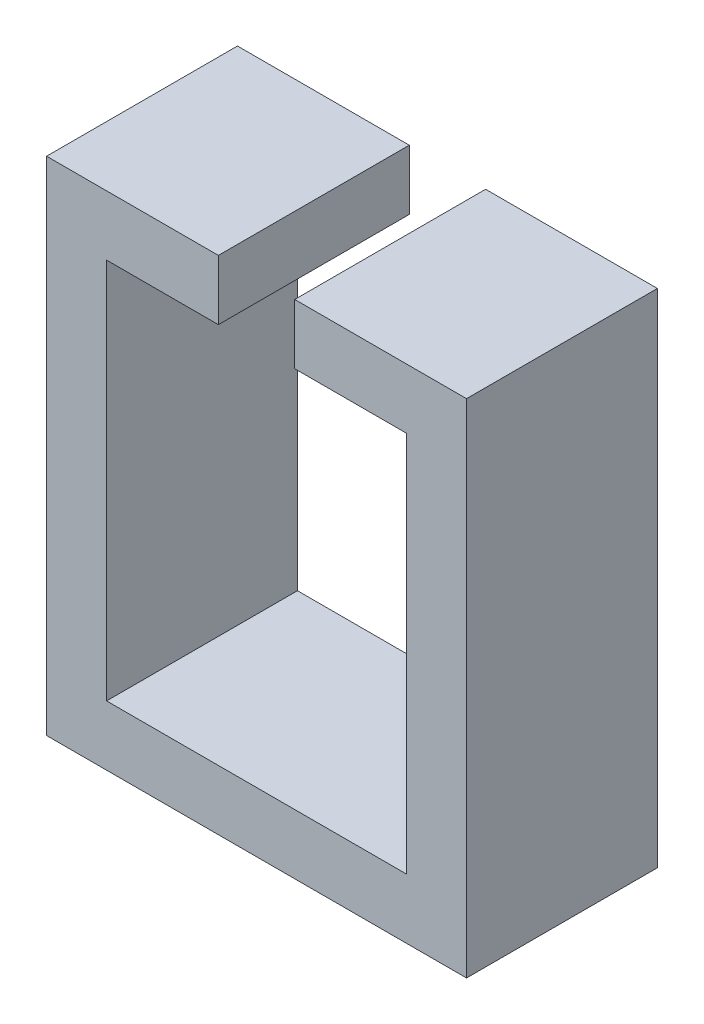
ISO-10303-21;
HEADER;
FILE_DESCRIPTION(('STEP AP214'),'2;1');
FILE_NAME('part.step','',(''),(''),'','','');
FILE_SCHEMA(('AUTOMOTIVE_DESIGN { 1 0 10303 214 1 1 1 1 }'));
ENDSEC;
DATA;
#1=APPLICATION_CONTEXT('core data for automotive mechanical design processes');
#2=APPLICATION_PROTOCOL_DEFINITION('international standard','automotive_design',2000,#1);
#3=PRODUCT_CONTEXT('',#1,'mechanical');
#4=PRODUCT('Part','Part','',(#3));
#5=PRODUCT_RELATED_PRODUCT_CATEGORY('part','',(#4));
#6=PRODUCT_DEFINITION_FORMATION('','',#4);
#7=PRODUCT_DEFINITION_CONTEXT('part definition',#1,'design');
#8=PRODUCT_DEFINITION('design','',#6,#7);
#9=PRODUCT_DEFINITION_SHAPE('','',#8);
#10=(LENGTH_UNIT() NAMED_UNIT(*) SI_UNIT(.MILLI.,.METRE.));
#11=(NAMED_UNIT(*) PLANE_ANGLE_UNIT() SI_UNIT($,.RADIAN.));
#12=(NAMED_UNIT(*) SI_UNIT($,.STERADIAN.) SOLID_ANGLE_UNIT());
#13=UNCERTAINTY_MEASURE_WITH_UNIT(LENGTH_MEASURE(1.E-05),#10,'distance_accuracy_value','');
#14=(GEOMETRIC_REPRESENTATION_CONTEXT(3) GLOBAL_UNCERTAINTY_ASSIGNED_CONTEXT((#13)) GLOBAL_UNIT_ASSIGNED_CONTEXT((#10,
#11,#12)) REPRESENTATION_CONTEXT('',''));
#15=CARTESIAN_POINT('',(0.,0.,0.));
#16=DIRECTION('',(0.,0.,1.));
#17=DIRECTION('',(1.,0.,0.));
#18=AXIS2_PLACEMENT_3D('',#15,#16,#17);
#19=CARTESIAN_POINT('',(3.85,4.6,3.5));
#20=DIRECTION('',(-1.,0.,0.));
#21=DIRECTION('',(0.,-1.,0.));
#22=AXIS2_PLACEMENT_3D('',#19,#20,#21);
#23=PLANE('',#22);
#24=DIRECTION('',(0.,1.,0.));
#25=VECTOR('',#24,1.);
#26=CARTESIAN_POINT('',(3.85,4.6,0.));
#27=LINE('',#26,#25);
#28=CARTESIAN_POINT('',(3.85,-4.6,0.));
#29=VERTEX_POINT('',#28);
#30=CARTESIAN_POINT('',(3.85,4.6,0.));
#31=VERTEX_POINT('',#30);
#32=EDGE_CURVE('E153',#29,#31,#27,.T.);
#33=ORIENTED_EDGE('',*,*,#32,.T.);
#34=DIRECTION('',(0.,0.,-1.));
#35=VECTOR('',#34,1.);
#36=CARTESIAN_POINT('',(3.85,4.6,3.5));
#37=LINE('',#36,#35);
#38=CARTESIAN_POINT('',(3.85,4.6,3.5));
#39=VERTEX_POINT('',#38);
#40=EDGE_CURVE('E11',#39,#31,#37,.T.);
#41=ORIENTED_EDGE('',*,*,#40,.F.);
#42=DIRECTION('',(0.,1.,0.));
#43=VECTOR('',#42,1.);
#44=CARTESIAN_POINT('',(3.85,4.6,3.5));
#45=LINE('',#44,#43);
#46=CARTESIAN_POINT('',(3.85,-4.6,3.5));
#47=VERTEX_POINT('',#46);
#48=EDGE_CURVE('E175',#47,#39,#45,.T.);
#49=ORIENTED_EDGE('',*,*,#48,.F.);
#50=DIRECTION('',(0.,0.,-1.));
#51=VECTOR('',#50,1.);
#52=CARTESIAN_POINT('',(3.85,-4.6,3.5));
#53=LINE('',#52,#51);
#54=EDGE_CURVE('E149',#47,#29,#53,.T.);
#55=ORIENTED_EDGE('',*,*,#54,.T.);
#56=EDGE_LOOP('',(#33,#41,#49,#55));
#57=FACE_BOUND('',#56,.T.);
#58=ADVANCED_FACE('F33',(#57),#23,.F.);
#59=CARTESIAN_POINT('',(0.7,4.6,3.5));
#60=DIRECTION('',(0.,-1.,0.));
#61=DIRECTION('',(0.,0.,-1.));
#62=AXIS2_PLACEMENT_3D('',#59,#60,#61);
#63=PLANE('',#62);
#64=DIRECTION('',(-1.,0.,0.));
#65=VECTOR('',#64,1.);
#66=CARTESIAN_POINT('',(0.7,4.6,0.));
#67=LINE('',#66,#65);
#68=CARTESIAN_POINT('',(0.7,4.6,0.));
#69=VERTEX_POINT('',#68);
#70=EDGE_CURVE('E156',#31,#69,#67,.T.);
#71=ORIENTED_EDGE('',*,*,#70,.T.);
#72=DIRECTION('',(0.,0.,-1.));
#73=VECTOR('',#72,1.);
#74=CARTESIAN_POINT('',(0.7,4.6,3.5));
#75=LINE('',#74,#73);
#76=CARTESIAN_POINT('',(0.7,4.6,3.5));
#77=VERTEX_POINT('',#76);
#78=EDGE_CURVE('E41',#77,#69,#75,.T.);
#79=ORIENTED_EDGE('',*,*,#78,.F.);
#80=DIRECTION('',(-1.,0.,0.));
#81=VECTOR('',#80,1.);
#82=CARTESIAN_POINT('',(0.7,4.6,3.5));
#83=LINE('',#82,#81);
#84=EDGE_CURVE('E104',#39,#77,#83,.T.);
#85=ORIENTED_EDGE('',*,*,#84,.F.);
#86=ORIENTED_EDGE('',*,*,#40,.T.);
#87=EDGE_LOOP('',(#71,#79,#85,#86));
#88=FACE_BOUND('',#87,.T.);
#89=ADVANCED_FACE('F253',(#88),#63,.F.);
#90=CARTESIAN_POINT('',(0.7,4.6,3.5));
#91=DIRECTION('',(1.,0.,0.));
#92=DIRECTION('',(0.,1.,0.));
#93=AXIS2_PLACEMENT_3D('',#90,#91,#92);
#94=PLANE('',#93);
#95=DIRECTION('',(0.,-1.,0.));
#96=VECTOR('',#95,1.);
#97=CARTESIAN_POINT('',(0.7,4.6,0.));
#98=LINE('',#97,#96);
#99=CARTESIAN_POINT('',(0.7,3.5,0.));
#100=VERTEX_POINT('',#99);
#101=EDGE_CURVE('E158',#69,#100,#98,.T.);
#102=ORIENTED_EDGE('',*,*,#101,.T.);
#103=DIRECTION('',(0.,0.,-1.));
#104=VECTOR('',#103,1.);
#105=CARTESIAN_POINT('',(0.7,3.5,3.5));
#106=LINE('',#105,#104);
#107=CARTESIAN_POINT('',(0.7,3.5,3.5));
#108=VERTEX_POINT('',#107);
#109=EDGE_CURVE('E194',#108,#100,#106,.T.);
#110=ORIENTED_EDGE('',*,*,#109,.F.);
#111=DIRECTION('',(0.,-1.,0.));
#112=VECTOR('',#111,1.);
#113=CARTESIAN_POINT('',(0.7,4.6,3.5));
#114=LINE('',#113,#112);
#115=EDGE_CURVE('E202',#77,#108,#114,.T.);
#116=ORIENTED_EDGE('',*,*,#115,.F.);
#117=ORIENTED_EDGE('',*,*,#78,.T.);
#118=EDGE_LOOP('',(#102,#110,#116,#117));
#119=FACE_BOUND('',#118,.T.);
#120=ADVANCED_FACE('F200',(#119),#94,.F.);
#121=CARTESIAN_POINT('',(0.7,3.5,3.5));
#122=DIRECTION('',(0.,1.,0.));
#123=DIRECTION('',(0.,0.,1.));
#124=AXIS2_PLACEMENT_3D('',#121,#122,#123);
#125=PLANE('',#124);
#126=DIRECTION('',(1.,0.,0.));
#127=VECTOR('',#126,1.);
#128=CARTESIAN_POINT('',(0.7,3.5,0.));
#129=LINE('',#128,#127);
#130=CARTESIAN_POINT('',(2.75,3.5,0.));
#131=VERTEX_POINT('',#130);
#132=EDGE_CURVE('E160',#100,#131,#129,.T.);
#133=ORIENTED_EDGE('',*,*,#132,.T.);
#134=DIRECTION('',(0.,0.,-1.));
#135=VECTOR('',#134,1.);
#136=CARTESIAN_POINT('',(2.75,3.5,3.5));
#137=LINE('',#136,#135);
#138=CARTESIAN_POINT('',(2.75,3.5,3.5));
#139=VERTEX_POINT('',#138);
#140=EDGE_CURVE('E191',#139,#131,#137,.T.);
#141=ORIENTED_EDGE('',*,*,#140,.F.);
#142=DIRECTION('',(1.,0.,0.));
#143=VECTOR('',#142,1.);
#144=CARTESIAN_POINT('',(0.7,3.5,3.5));
#145=LINE('',#144,#143);
#146=EDGE_CURVE('E220',#108,#139,#145,.T.);
#147=ORIENTED_EDGE('',*,*,#146,.F.);
#148=ORIENTED_EDGE('',*,*,#109,.T.);
#149=EDGE_LOOP('',(#133,#141,#147,#148));
#150=FACE_BOUND('',#149,.T.);
#151=ADVANCED_FACE('F211',(#150),#125,.F.);
#152=CARTESIAN_POINT('',(2.75,3.5,3.5));
#153=DIRECTION('',(1.,0.,0.));
#154=DIRECTION('',(0.,1.,0.));
#155=AXIS2_PLACEMENT_3D('',#152,#153,#154);
#156=PLANE('',#155);
#157=DIRECTION('',(0.,-1.,0.));
#158=VECTOR('',#157,1.);
#159=CARTESIAN_POINT('',(2.75,3.5,0.));
#160=LINE('',#159,#158);
#161=CARTESIAN_POINT('',(2.75,-3.5,0.));
#162=VERTEX_POINT('',#161);
#163=EDGE_CURVE('E162',#131,#162,#160,.T.);
#164=ORIENTED_EDGE('',*,*,#163,.T.);
#165=DIRECTION('',(0.,0.,-1.));
#166=VECTOR('',#165,1.);
#167=CARTESIAN_POINT('',(2.75,-3.5,3.5));
#168=LINE('',#167,#166);
#169=CARTESIAN_POINT('',(2.75,-3.5,3.5));
#170=VERTEX_POINT('',#169);
#171=EDGE_CURVE('E188',#170,#162,#168,.T.);
#172=ORIENTED_EDGE('',*,*,#171,.F.);
#173=DIRECTION('',(0.,-1.,0.));
#174=VECTOR('',#173,1.);
#175=CARTESIAN_POINT('',(2.75,3.5,3.5));
#176=LINE('',#175,#174);
#177=EDGE_CURVE('E217',#139,#170,#176,.T.);
#178=ORIENTED_EDGE('',*,*,#177,.F.);
#179=ORIENTED_EDGE('',*,*,#140,.T.);
#180=EDGE_LOOP('',(#164,#172,#178,#179));
#181=FACE_BOUND('',#180,.T.);
#182=ADVANCED_FACE('F215',(#181),#156,.F.);
#183=CARTESIAN_POINT('',(-2.75,-3.5,3.5));
#184=DIRECTION('',(0.,-1.,0.));
#185=DIRECTION('',(0.,0.,-1.));
#186=AXIS2_PLACEMENT_3D('',#183,#184,#185);
#187=PLANE('',#186);
#188=DIRECTION('',(-1.,0.,0.));
#189=VECTOR('',#188,1.);
#190=CARTESIAN_POINT('',(-2.75,-3.5,0.));
#191=LINE('',#190,#189);
#192=CARTESIAN_POINT('',(-2.75,-3.5,0.));
#193=VERTEX_POINT('',#192);
#194=EDGE_CURVE('E164',#162,#193,#191,.T.);
#195=ORIENTED_EDGE('',*,*,#194,.T.);
#196=DIRECTION('',(0.,0.,-1.));
#197=VECTOR('',#196,1.);
#198=CARTESIAN_POINT('',(-2.75,-3.5,3.5));
#199=LINE('',#198,#197);
#200=CARTESIAN_POINT('',(-2.75,-3.5,3.5));
#201=VERTEX_POINT('',#200);
#202=EDGE_CURVE('E185',#201,#193,#199,.T.);
#203=ORIENTED_EDGE('',*,*,#202,.F.);
#204=DIRECTION('',(-1.,0.,0.));
#205=VECTOR('',#204,1.);
#206=CARTESIAN_POINT('',(-2.75,-3.5,3.5));
#207=LINE('',#206,#205);
#208=EDGE_CURVE('E219',#170,#201,#207,.T.);
#209=ORIENTED_EDGE('',*,*,#208,.F.);
#210=ORIENTED_EDGE('',*,*,#171,.T.);
#211=EDGE_LOOP('',(#195,#203,#209,#210));
#212=FACE_BOUND('',#211,.T.);
#213=ADVANCED_FACE('F266',(#212),#187,.F.);
#214=CARTESIAN_POINT('',(-2.75,3.5,3.5));
#215=DIRECTION('',(-1.,0.,0.));
#216=DIRECTION('',(0.,-1.,0.));
#217=AXIS2_PLACEMENT_3D('',#214,#215,#216);
#218=PLANE('',#217);
#219=DIRECTION('',(0.,1.,0.));
#220=VECTOR('',#219,1.);
#221=CARTESIAN_POINT('',(-2.75,3.5,0.));
#222=LINE('',#221,#220);
#223=CARTESIAN_POINT('',(-2.75,3.5,0.));
#224=VERTEX_POINT('',#223);
#225=EDGE_CURVE('E166',#193,#224,#222,.T.);
#226=ORIENTED_EDGE('',*,*,#225,.T.);
#227=DIRECTION('',(0.,0.,-1.));
#228=VECTOR('',#227,1.);
#229=CARTESIAN_POINT('',(-2.75,3.5,3.5));
#230=LINE('',#229,#228);
#231=CARTESIAN_POINT('',(-2.75,3.5,3.5));
#232=VERTEX_POINT('',#231);
#233=EDGE_CURVE('E182',#232,#224,#230,.T.);
#234=ORIENTED_EDGE('',*,*,#233,.F.);
#235=DIRECTION('',(0.,1.,0.));
#236=VECTOR('',#235,1.);
#237=CARTESIAN_POINT('',(-2.75,3.5,3.5));
#238=LINE('',#237,#236);
#239=EDGE_CURVE('E222',#201,#232,#238,.T.);
#240=ORIENTED_EDGE('',*,*,#239,.F.);
#241=ORIENTED_EDGE('',*,*,#202,.T.);
#242=EDGE_LOOP('',(#226,#234,#240,#241));
#243=FACE_BOUND('',#242,.T.);
#244=ADVANCED_FACE('F269',(#243),#218,.F.);
#245=CARTESIAN_POINT('',(-2.75,3.5,3.5));
#246=DIRECTION('',(0.,1.,0.));
#247=DIRECTION('',(0.,0.,1.));
#248=AXIS2_PLACEMENT_3D('',#245,#246,#247);
#249=PLANE('',#248);
#250=DIRECTION('',(1.,0.,0.));
#251=VECTOR('',#250,1.);
#252=CARTESIAN_POINT('',(-2.75,3.5,0.));
#253=LINE('',#252,#251);
#254=CARTESIAN_POINT('',(-0.7,3.5,0.));
#255=VERTEX_POINT('',#254);
#256=EDGE_CURVE('E168',#224,#255,#253,.T.);
#257=ORIENTED_EDGE('',*,*,#256,.T.);
#258=DIRECTION('',(0.,0.,-1.));
#259=VECTOR('',#258,1.);
#260=CARTESIAN_POINT('',(-0.7,3.5,3.5));
#261=LINE('',#260,#259);
#262=CARTESIAN_POINT('',(-0.7,3.5,3.5));
#263=VERTEX_POINT('',#262);
#264=EDGE_CURVE('E179',#263,#255,#261,.T.);
#265=ORIENTED_EDGE('',*,*,#264,.F.);
#266=DIRECTION('',(1.,0.,0.));
#267=VECTOR('',#266,1.);
#268=CARTESIAN_POINT('',(-2.75,3.5,3.5));
#269=LINE('',#268,#267);
#270=EDGE_CURVE('E228',#232,#263,#269,.T.);
#271=ORIENTED_EDGE('',*,*,#270,.F.);
#272=ORIENTED_EDGE('',*,*,#233,.T.);
#273=EDGE_LOOP('',(#257,#265,#271,#272));
#274=FACE_BOUND('',#273,.T.);
#275=ADVANCED_FACE('F234',(#274),#249,.F.);
#276=CARTESIAN_POINT('',(-0.7,4.6,3.5));
#277=DIRECTION('',(-1.,0.,0.));
#278=DIRECTION('',(0.,0.,1.));
#279=AXIS2_PLACEMENT_3D('',#276,#277,#278);
#280=PLANE('',#279);
#281=DIRECTION('',(0.,1.,0.));
#282=VECTOR('',#281,1.);
#283=CARTESIAN_POINT('',(-0.7,4.6,0.));
#284=LINE('',#283,#282);
#285=CARTESIAN_POINT('',(-0.7,4.6,0.));
#286=VERTEX_POINT('',#285);
#287=EDGE_CURVE('E170',#255,#286,#284,.T.);
#288=ORIENTED_EDGE('',*,*,#287,.T.);
#289=DIRECTION('',(0.,0.,-1.));
#290=VECTOR('',#289,1.);
#291=CARTESIAN_POINT('',(-0.7,4.6,3.5));
#292=LINE('',#291,#290);
#293=CARTESIAN_POINT('',(-0.7,4.6,3.5));
#294=VERTEX_POINT('',#293);
#295=EDGE_CURVE('E144',#294,#286,#292,.T.);
#296=ORIENTED_EDGE('',*,*,#295,.F.);
#297=DIRECTION('',(0.,1.,0.));
#298=VECTOR('',#297,1.);
#299=CARTESIAN_POINT('',(-0.7,4.6,3.5));
#300=LINE('',#299,#298);
#301=EDGE_CURVE('E135',#263,#294,#300,.T.);
#302=ORIENTED_EDGE('',*,*,#301,.F.);
#303=ORIENTED_EDGE('',*,*,#264,.T.);
#304=EDGE_LOOP('',(#288,#296,#302,#303));
#305=FACE_BOUND('',#304,.T.);
#306=ADVANCED_FACE('F238',(#305),#280,.F.);
#307=CARTESIAN_POINT('',(-3.85,4.6,3.5));
#308=DIRECTION('',(0.,-1.,0.));
#309=DIRECTION('',(0.,0.,-1.));
#310=AXIS2_PLACEMENT_3D('',#307,#308,#309);
#311=PLANE('',#310);
#312=DIRECTION('',(-1.,0.,0.));
#313=VECTOR('',#312,1.);
#314=CARTESIAN_POINT('',(-3.85,4.6,0.));
#315=LINE('',#314,#313);
#316=CARTESIAN_POINT('',(-3.85,4.6,0.));
#317=VERTEX_POINT('',#316);
#318=EDGE_CURVE('E143',#286,#317,#315,.T.);
#319=ORIENTED_EDGE('',*,*,#318,.T.);
#320=DIRECTION('',(0.,0.,-1.));
#321=VECTOR('',#320,1.);
#322=CARTESIAN_POINT('',(-3.85,4.6,3.5));
#323=LINE('',#322,#321);
#324=CARTESIAN_POINT('',(-3.85,4.6,3.5));
#325=VERTEX_POINT('',#324);
#326=EDGE_CURVE('E140',#325,#317,#323,.T.);
#327=ORIENTED_EDGE('',*,*,#326,.F.);
#328=DIRECTION('',(-1.,0.,0.));
#329=VECTOR('',#328,1.);
#330=CARTESIAN_POINT('',(-3.85,4.6,3.5));
#331=LINE('',#330,#329);
#332=EDGE_CURVE('E129',#294,#325,#331,.T.);
#333=ORIENTED_EDGE('',*,*,#332,.F.);
#334=ORIENTED_EDGE('',*,*,#295,.T.);
#335=EDGE_LOOP('',(#319,#327,#333,#334));
#336=FACE_BOUND('',#335,.T.);
#337=ADVANCED_FACE('F141',(#336),#311,.F.);
#338=CARTESIAN_POINT('',(-3.85,4.6,3.5));
#339=DIRECTION('',(1.,0.,0.));
#340=DIRECTION('',(0.,1.,0.));
#341=AXIS2_PLACEMENT_3D('',#338,#339,#340);
#342=PLANE('',#341);
#343=DIRECTION('',(0.,-1.,0.));
#344=VECTOR('',#343,1.);
#345=CARTESIAN_POINT('',(-3.85,4.6,0.));
#346=LINE('',#345,#344);
#347=CARTESIAN_POINT('',(-3.85,-4.6,0.));
#348=VERTEX_POINT('',#347);
#349=EDGE_CURVE('E90',#317,#348,#346,.T.);
#350=ORIENTED_EDGE('',*,*,#349,.T.);
#351=DIRECTION('',(0.,0.,-1.));
#352=VECTOR('',#351,1.);
#353=CARTESIAN_POINT('',(-3.85,-4.6,3.5));
#354=LINE('',#353,#352);
#355=CARTESIAN_POINT('',(-3.85,-4.6,3.5));
#356=VERTEX_POINT('',#355);
#357=EDGE_CURVE('E145',#356,#348,#354,.T.);
#358=ORIENTED_EDGE('',*,*,#357,.F.);
#359=DIRECTION('',(0.,-1.,0.));
#360=VECTOR('',#359,1.);
#361=CARTESIAN_POINT('',(-3.85,4.6,3.5));
#362=LINE('',#361,#360);
#363=EDGE_CURVE('E133',#325,#356,#362,.T.);
#364=ORIENTED_EDGE('',*,*,#363,.F.);
#365=ORIENTED_EDGE('',*,*,#326,.T.);
#366=EDGE_LOOP('',(#350,#358,#364,#365));
#367=FACE_BOUND('',#366,.T.);
#368=ADVANCED_FACE('F147',(#367),#342,.F.);
#369=CARTESIAN_POINT('',(-3.85,-4.6,3.5));
#370=DIRECTION('',(0.,1.,0.));
#371=DIRECTION('',(0.,0.,1.));
#372=AXIS2_PLACEMENT_3D('',#369,#370,#371);
#373=PLANE('',#372);
#374=DIRECTION('',(1.,0.,0.));
#375=VECTOR('',#374,1.);
#376=CARTESIAN_POINT('',(-3.85,-4.6,0.));
#377=LINE('',#376,#375);
#378=EDGE_CURVE('E96',#348,#29,#377,.T.);
#379=ORIENTED_EDGE('',*,*,#378,.T.);
#380=ORIENTED_EDGE('',*,*,#54,.F.);
#381=DIRECTION('',(1.,0.,0.));
#382=VECTOR('',#381,1.);
#383=CARTESIAN_POINT('',(-3.85,-4.6,3.5));
#384=LINE('',#383,#382);
#385=EDGE_CURVE('E49',#356,#47,#384,.T.);
#386=ORIENTED_EDGE('',*,*,#385,.F.);
#387=ORIENTED_EDGE('',*,*,#357,.T.);
#388=EDGE_LOOP('',(#379,#380,#386,#387));
#389=FACE_BOUND('',#388,.T.);
#390=ADVANCED_FACE('F242',(#389),#373,.F.);
#391=CARTESIAN_POINT('',(0.,0.,3.5));
#392=DIRECTION('',(0.,0.,1.));
#393=DIRECTION('',(1.,0.,0.));
#394=AXIS2_PLACEMENT_3D('',#391,#392,#393);
#395=PLANE('',#394);
#396=ORIENTED_EDGE('',*,*,#48,.T.);
#397=ORIENTED_EDGE('',*,*,#84,.T.);
#398=ORIENTED_EDGE('',*,*,#115,.T.);
#399=ORIENTED_EDGE('',*,*,#146,.T.);
#400=ORIENTED_EDGE('',*,*,#177,.T.);
#401=ORIENTED_EDGE('',*,*,#208,.T.);
#402=ORIENTED_EDGE('',*,*,#239,.T.);
#403=ORIENTED_EDGE('',*,*,#270,.T.);
#404=ORIENTED_EDGE('',*,*,#301,.T.);
#405=ORIENTED_EDGE('',*,*,#332,.T.);
#406=ORIENTED_EDGE('',*,*,#363,.T.);
#407=ORIENTED_EDGE('',*,*,#385,.T.);
#408=EDGE_LOOP('',(#396,#397,#398,#399,#400,#401,#402,#403,#404,#405,#406,#407));
#409=FACE_BOUND('',#408,.T.);
#410=ADVANCED_FACE('F131',(#409),#395,.T.);
#411=CARTESIAN_POINT('',(0.,0.,0.));
#412=DIRECTION('',(0.,0.,1.));
#413=DIRECTION('',(1.,0.,0.));
#414=AXIS2_PLACEMENT_3D('',#411,#412,#413);
#415=PLANE('',#414);
#416=ORIENTED_EDGE('',*,*,#32,.F.);
#417=ORIENTED_EDGE('',*,*,#378,.F.);
#418=ORIENTED_EDGE('',*,*,#349,.F.);
#419=ORIENTED_EDGE('',*,*,#318,.F.);
#420=ORIENTED_EDGE('',*,*,#287,.F.);
#421=ORIENTED_EDGE('',*,*,#256,.F.);
#422=ORIENTED_EDGE('',*,*,#225,.F.);
#423=ORIENTED_EDGE('',*,*,#194,.F.);
#424=ORIENTED_EDGE('',*,*,#163,.F.);
#425=ORIENTED_EDGE('',*,*,#132,.F.);
#426=ORIENTED_EDGE('',*,*,#101,.F.);
#427=ORIENTED_EDGE('',*,*,#70,.F.);
#428=EDGE_LOOP('',(#416,#417,#418,#419,#420,#421,#422,#423,#424,#425,#426,#427));
#429=FACE_BOUND('',#428,.T.);
#430=ADVANCED_FACE('F206',(#429),#415,.F.);
#431=CLOSED_SHELL('',(#58,#89,#120,#151,#182,#213,#244,#275,#306,#337,#368,#390,#410,#430));
#432=MANIFOLD_SOLID_BREP('B2',#431);
#433=ADVANCED_BREP_SHAPE_REPRESENTATION('',(#18,#432),#14);
#434=SHAPE_DEFINITION_REPRESENTATION(#9,#433);
ENDSEC;
END-ISO-10303-21;
